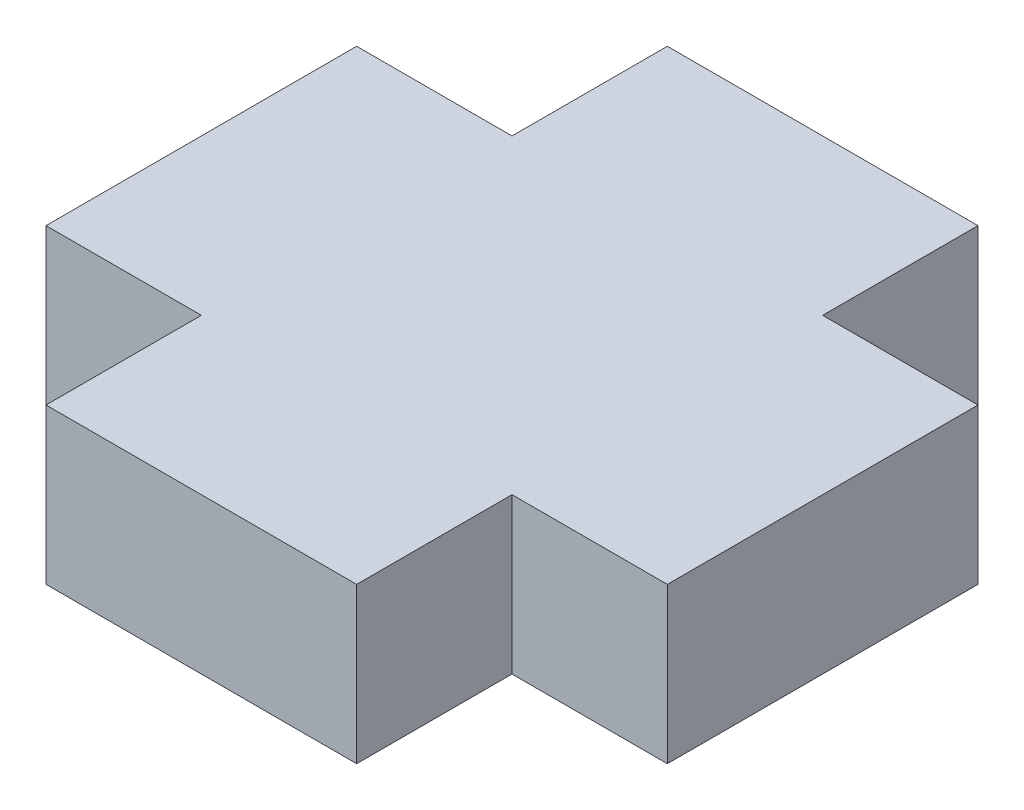
ISO-10303-21;
HEADER;
FILE_DESCRIPTION(('STEP AP214'),'2;1');
FILE_NAME('part.step','',(''),(''),'','','');
FILE_SCHEMA(('AUTOMOTIVE_DESIGN { 1 0 10303 214 1 1 1 1 }'));
ENDSEC;
DATA;
#1=APPLICATION_CONTEXT('core data for automotive mechanical design processes');
#2=APPLICATION_PROTOCOL_DEFINITION('international standard','automotive_design',2000,#1);
#3=PRODUCT_CONTEXT('',#1,'mechanical');
#4=PRODUCT('Part','Part','',(#3));
#5=PRODUCT_RELATED_PRODUCT_CATEGORY('part','',(#4));
#6=PRODUCT_DEFINITION_FORMATION('','',#4);
#7=PRODUCT_DEFINITION_CONTEXT('part definition',#1,'design');
#8=PRODUCT_DEFINITION('design','',#6,#7);
#9=PRODUCT_DEFINITION_SHAPE('','',#8);
#10=(LENGTH_UNIT() NAMED_UNIT(*) SI_UNIT(.MILLI.,.METRE.));
#11=(NAMED_UNIT(*) PLANE_ANGLE_UNIT() SI_UNIT($,.RADIAN.));
#12=(NAMED_UNIT(*) SI_UNIT($,.STERADIAN.) SOLID_ANGLE_UNIT());
#13=UNCERTAINTY_MEASURE_WITH_UNIT(LENGTH_MEASURE(1.E-05),#10,'distance_accuracy_value','');
#14=(GEOMETRIC_REPRESENTATION_CONTEXT(3) GLOBAL_UNCERTAINTY_ASSIGNED_CONTEXT((#13)) GLOBAL_UNIT_ASSIGNED_CONTEXT((#10,
#11,#12)) REPRESENTATION_CONTEXT('',''));
#15=CARTESIAN_POINT('',(0.,0.,0.));
#16=DIRECTION('',(0.,0.,1.));
#17=DIRECTION('',(1.,0.,0.));
#18=AXIS2_PLACEMENT_3D('',#15,#16,#17);
#19=CARTESIAN_POINT('',(0.,5.,0.));
#20=DIRECTION('',(1.,0.,0.));
#21=DIRECTION('',(0.,0.,-1.));
#22=AXIS2_PLACEMENT_3D('',#19,#20,#21);
#23=PLANE('',#22);
#24=DIRECTION('',(0.,0.,1.));
#25=VECTOR('',#24,1.);
#26=CARTESIAN_POINT('',(0.,0.,0.));
#27=LINE('',#26,#25);
#28=CARTESIAN_POINT('',(0.,0.,-10.));
#29=VERTEX_POINT('',#28);
#30=CARTESIAN_POINT('',(0.,0.,0.));
#31=VERTEX_POINT('',#30);
#32=EDGE_CURVE('E155',#29,#31,#27,.T.);
#33=ORIENTED_EDGE('',*,*,#32,.T.);
#34=DIRECTION('',(0.,-1.,0.));
#35=VECTOR('',#34,1.);
#36=CARTESIAN_POINT('',(0.,5.,0.));
#37=LINE('',#36,#35);
#38=CARTESIAN_POINT('',(0.,5.,0.));
#39=VERTEX_POINT('',#38);
#40=EDGE_CURVE('E11',#39,#31,#37,.T.);
#41=ORIENTED_EDGE('',*,*,#40,.F.);
#42=DIRECTION('',(0.,0.,1.));
#43=VECTOR('',#42,1.);
#44=CARTESIAN_POINT('',(0.,5.,0.));
#45=LINE('',#44,#43);
#46=CARTESIAN_POINT('',(0.,5.,-10.));
#47=VERTEX_POINT('',#46);
#48=EDGE_CURVE('E177',#47,#39,#45,.T.);
#49=ORIENTED_EDGE('',*,*,#48,.F.);
#50=DIRECTION('',(0.,-1.,0.));
#51=VECTOR('',#50,1.);
#52=CARTESIAN_POINT('',(0.,5.,-10.));
#53=LINE('',#52,#51);
#54=EDGE_CURVE('E151',#47,#29,#53,.T.);
#55=ORIENTED_EDGE('',*,*,#54,.T.);
#56=EDGE_LOOP('',(#33,#41,#49,#55));
#57=FACE_BOUND('',#56,.T.);
#58=ADVANCED_FACE('F35',(#57),#23,.F.);
#59=CARTESIAN_POINT('',(0.,5.,0.));
#60=DIRECTION('',(0.,0.,-1.));
#61=DIRECTION('',(-1.,0.,0.));
#62=AXIS2_PLACEMENT_3D('',#59,#60,#61);
#63=PLANE('',#62);
#64=DIRECTION('',(1.,0.,0.));
#65=VECTOR('',#64,1.);
#66=CARTESIAN_POINT('',(0.,0.,0.));
#67=LINE('',#66,#65);
#68=CARTESIAN_POINT('',(5.,0.,0.));
#69=VERTEX_POINT('',#68);
#70=EDGE_CURVE('E158',#31,#69,#67,.T.);
#71=ORIENTED_EDGE('',*,*,#70,.T.);
#72=DIRECTION('',(0.,-1.,0.));
#73=VECTOR('',#72,1.);
#74=CARTESIAN_POINT('',(5.,5.,0.));
#75=LINE('',#74,#73);
#76=CARTESIAN_POINT('',(5.,5.,0.));
#77=VERTEX_POINT('',#76);
#78=EDGE_CURVE('E43',#77,#69,#75,.T.);
#79=ORIENTED_EDGE('',*,*,#78,.F.);
#80=DIRECTION('',(1.,0.,0.));
#81=VECTOR('',#80,1.);
#82=CARTESIAN_POINT('',(0.,5.,0.));
#83=LINE('',#82,#81);
#84=EDGE_CURVE('E106',#39,#77,#83,.T.);
#85=ORIENTED_EDGE('',*,*,#84,.F.);
#86=ORIENTED_EDGE('',*,*,#40,.T.);
#87=EDGE_LOOP('',(#71,#79,#85,#86));
#88=FACE_BOUND('',#87,.T.);
#89=ADVANCED_FACE('F255',(#88),#63,.F.);
#90=CARTESIAN_POINT('',(5.,5.,0.));
#91=DIRECTION('',(1.,0.,0.));
#92=DIRECTION('',(0.,0.,-1.));
#93=AXIS2_PLACEMENT_3D('',#90,#91,#92);
#94=PLANE('',#93);
#95=DIRECTION('',(0.,0.,1.));
#96=VECTOR('',#95,1.);
#97=CARTESIAN_POINT('',(5.,0.,0.));
#98=LINE('',#97,#96);
#99=CARTESIAN_POINT('',(5.,0.,5.));
#100=VERTEX_POINT('',#99);
#101=EDGE_CURVE('E160',#69,#100,#98,.T.);
#102=ORIENTED_EDGE('',*,*,#101,.T.);
#103=DIRECTION('',(0.,-1.,0.));
#104=VECTOR('',#103,1.);
#105=CARTESIAN_POINT('',(5.,5.,5.));
#106=LINE('',#105,#104);
#107=CARTESIAN_POINT('',(5.,5.,5.));
#108=VERTEX_POINT('',#107);
#109=EDGE_CURVE('E196',#108,#100,#106,.T.);
#110=ORIENTED_EDGE('',*,*,#109,.F.);
#111=DIRECTION('',(0.,0.,1.));
#112=VECTOR('',#111,1.);
#113=CARTESIAN_POINT('',(5.,5.,0.));
#114=LINE('',#113,#112);
#115=EDGE_CURVE('E204',#77,#108,#114,.T.);
#116=ORIENTED_EDGE('',*,*,#115,.F.);
#117=ORIENTED_EDGE('',*,*,#78,.T.);
#118=EDGE_LOOP('',(#102,#110,#116,#117));
#119=FACE_BOUND('',#118,.T.);
#120=ADVANCED_FACE('F202',(#119),#94,.F.);
#121=CARTESIAN_POINT('',(5.,5.,5.));
#122=DIRECTION('',(0.,0.,-1.));
#123=DIRECTION('',(-1.,0.,0.));
#124=AXIS2_PLACEMENT_3D('',#121,#122,#123);
#125=PLANE('',#124);
#126=DIRECTION('',(1.,0.,0.));
#127=VECTOR('',#126,1.);
#128=CARTESIAN_POINT('',(5.,0.,5.));
#129=LINE('',#128,#127);
#130=CARTESIAN_POINT('',(15.,0.,5.));
#131=VERTEX_POINT('',#130);
#132=EDGE_CURVE('E162',#100,#131,#129,.T.);
#133=ORIENTED_EDGE('',*,*,#132,.T.);
#134=DIRECTION('',(0.,-1.,0.));
#135=VECTOR('',#134,1.);
#136=CARTESIAN_POINT('',(15.,5.,5.));
#137=LINE('',#136,#135);
#138=CARTESIAN_POINT('',(15.,5.,5.));
#139=VERTEX_POINT('',#138);
#140=EDGE_CURVE('E193',#139,#131,#137,.T.);
#141=ORIENTED_EDGE('',*,*,#140,.F.);
#142=DIRECTION('',(1.,0.,0.));
#143=VECTOR('',#142,1.);
#144=CARTESIAN_POINT('',(5.,5.,5.));
#145=LINE('',#144,#143);
#146=EDGE_CURVE('E222',#108,#139,#145,.T.);
#147=ORIENTED_EDGE('',*,*,#146,.F.);
#148=ORIENTED_EDGE('',*,*,#109,.T.);
#149=EDGE_LOOP('',(#133,#141,#147,#148));
#150=FACE_BOUND('',#149,.T.);
#151=ADVANCED_FACE('F213',(#150),#125,.F.);
#152=CARTESIAN_POINT('',(15.,5.,0.));
#153=DIRECTION('',(-1.,0.,0.));
#154=DIRECTION('',(0.,0.,1.));
#155=AXIS2_PLACEMENT_3D('',#152,#153,#154);
#156=PLANE('',#155);
#157=DIRECTION('',(0.,0.,-1.));
#158=VECTOR('',#157,1.);
#159=CARTESIAN_POINT('',(15.,0.,0.));
#160=LINE('',#159,#158);
#161=CARTESIAN_POINT('',(15.,0.,0.));
#162=VERTEX_POINT('',#161);
#163=EDGE_CURVE('E164',#131,#162,#160,.T.);
#164=ORIENTED_EDGE('',*,*,#163,.T.);
#165=DIRECTION('',(0.,-1.,0.));
#166=VECTOR('',#165,1.);
#167=CARTESIAN_POINT('',(15.,5.,0.));
#168=LINE('',#167,#166);
#169=CARTESIAN_POINT('',(15.,5.,0.));
#170=VERTEX_POINT('',#169);
#171=EDGE_CURVE('E190',#170,#162,#168,.T.);
#172=ORIENTED_EDGE('',*,*,#171,.F.);
#173=DIRECTION('',(0.,0.,-1.));
#174=VECTOR('',#173,1.);
#175=CARTESIAN_POINT('',(15.,5.,0.));
#176=LINE('',#175,#174);
#177=EDGE_CURVE('E219',#139,#170,#176,.T.);
#178=ORIENTED_EDGE('',*,*,#177,.F.);
#179=ORIENTED_EDGE('',*,*,#140,.T.);
#180=EDGE_LOOP('',(#164,#172,#178,#179));
#181=FACE_BOUND('',#180,.T.);
#182=ADVANCED_FACE('F217',(#181),#156,.F.);
#183=CARTESIAN_POINT('',(15.,5.,0.));
#184=DIRECTION('',(0.,0.,-1.));
#185=DIRECTION('',(-1.,0.,0.));
#186=AXIS2_PLACEMENT_3D('',#183,#184,#185);
#187=PLANE('',#186);
#188=DIRECTION('',(1.,0.,0.));
#189=VECTOR('',#188,1.);
#190=CARTESIAN_POINT('',(15.,0.,0.));
#191=LINE('',#190,#189);
#192=CARTESIAN_POINT('',(20.,0.,0.));
#193=VERTEX_POINT('',#192);
#194=EDGE_CURVE('E166',#162,#193,#191,.T.);
#195=ORIENTED_EDGE('',*,*,#194,.T.);
#196=DIRECTION('',(0.,-1.,0.));
#197=VECTOR('',#196,1.);
#198=CARTESIAN_POINT('',(20.,5.,0.));
#199=LINE('',#198,#197);
#200=CARTESIAN_POINT('',(20.,5.,0.));
#201=VERTEX_POINT('',#200);
#202=EDGE_CURVE('E187',#201,#193,#199,.T.);
#203=ORIENTED_EDGE('',*,*,#202,.F.);
#204=DIRECTION('',(1.,0.,0.));
#205=VECTOR('',#204,1.);
#206=CARTESIAN_POINT('',(15.,5.,0.));
#207=LINE('',#206,#205);
#208=EDGE_CURVE('E221',#170,#201,#207,.T.);
#209=ORIENTED_EDGE('',*,*,#208,.F.);
#210=ORIENTED_EDGE('',*,*,#171,.T.);
#211=EDGE_LOOP('',(#195,#203,#209,#210));
#212=FACE_BOUND('',#211,.T.);
#213=ADVANCED_FACE('F268',(#212),#187,.F.);
#214=CARTESIAN_POINT('',(20.,5.,0.));
#215=DIRECTION('',(-1.,0.,0.));
#216=DIRECTION('',(0.,0.,1.));
#217=AXIS2_PLACEMENT_3D('',#214,#215,#216);
#218=PLANE('',#217);
#219=DIRECTION('',(0.,0.,-1.));
#220=VECTOR('',#219,1.);
#221=CARTESIAN_POINT('',(20.,0.,0.));
#222=LINE('',#221,#220);
#223=CARTESIAN_POINT('',(20.,0.,-10.));
#224=VERTEX_POINT('',#223);
#225=EDGE_CURVE('E168',#193,#224,#222,.T.);
#226=ORIENTED_EDGE('',*,*,#225,.T.);
#227=DIRECTION('',(0.,-1.,0.));
#228=VECTOR('',#227,1.);
#229=CARTESIAN_POINT('',(20.,5.,-10.));
#230=LINE('',#229,#228);
#231=CARTESIAN_POINT('',(20.,5.,-10.));
#232=VERTEX_POINT('',#231);
#233=EDGE_CURVE('E184',#232,#224,#230,.T.);
#234=ORIENTED_EDGE('',*,*,#233,.F.);
#235=DIRECTION('',(0.,0.,-1.));
#236=VECTOR('',#235,1.);
#237=CARTESIAN_POINT('',(20.,5.,0.));
#238=LINE('',#237,#236);
#239=EDGE_CURVE('E224',#201,#232,#238,.T.);
#240=ORIENTED_EDGE('',*,*,#239,.F.);
#241=ORIENTED_EDGE('',*,*,#202,.T.);
#242=EDGE_LOOP('',(#226,#234,#240,#241));
#243=FACE_BOUND('',#242,.T.);
#244=ADVANCED_FACE('F271',(#243),#218,.F.);
#245=CARTESIAN_POINT('',(15.,5.,-10.));
#246=DIRECTION('',(0.,0.,1.));
#247=DIRECTION('',(1.,0.,0.));
#248=AXIS2_PLACEMENT_3D('',#245,#246,#247);
#249=PLANE('',#248);
#250=DIRECTION('',(-1.,0.,0.));
#251=VECTOR('',#250,1.);
#252=CARTESIAN_POINT('',(15.,0.,-10.));
#253=LINE('',#252,#251);
#254=CARTESIAN_POINT('',(15.,0.,-10.));
#255=VERTEX_POINT('',#254);
#256=EDGE_CURVE('E170',#224,#255,#253,.T.);
#257=ORIENTED_EDGE('',*,*,#256,.T.);
#258=DIRECTION('',(0.,-1.,0.));
#259=VECTOR('',#258,1.);
#260=CARTESIAN_POINT('',(15.,5.,-10.));
#261=LINE('',#260,#259);
#262=CARTESIAN_POINT('',(15.,5.,-10.));
#263=VERTEX_POINT('',#262);
#264=EDGE_CURVE('E181',#263,#255,#261,.T.);
#265=ORIENTED_EDGE('',*,*,#264,.F.);
#266=DIRECTION('',(-1.,0.,0.));
#267=VECTOR('',#266,1.);
#268=CARTESIAN_POINT('',(15.,5.,-10.));
#269=LINE('',#268,#267);
#270=EDGE_CURVE('E230',#232,#263,#269,.T.);
#271=ORIENTED_EDGE('',*,*,#270,.F.);
#272=ORIENTED_EDGE('',*,*,#233,.T.);
#273=EDGE_LOOP('',(#257,#265,#271,#272));
#274=FACE_BOUND('',#273,.T.);
#275=ADVANCED_FACE('F236',(#274),#249,.F.);
#276=CARTESIAN_POINT('',(15.,5.,-10.));
#277=DIRECTION('',(-1.,0.,0.));
#278=DIRECTION('',(0.,0.,1.));
#279=AXIS2_PLACEMENT_3D('',#276,#277,#278);
#280=PLANE('',#279);
#281=DIRECTION('',(0.,0.,-1.));
#282=VECTOR('',#281,1.);
#283=CARTESIAN_POINT('',(15.,0.,-10.));
#284=LINE('',#283,#282);
#285=CARTESIAN_POINT('',(15.,0.,-15.));
#286=VERTEX_POINT('',#285);
#287=EDGE_CURVE('E172',#255,#286,#284,.T.);
#288=ORIENTED_EDGE('',*,*,#287,.T.);
#289=DIRECTION('',(0.,-1.,0.));
#290=VECTOR('',#289,1.);
#291=CARTESIAN_POINT('',(15.,5.,-15.));
#292=LINE('',#291,#290);
#293=CARTESIAN_POINT('',(15.,5.,-15.));
#294=VERTEX_POINT('',#293);
#295=EDGE_CURVE('E146',#294,#286,#292,.T.);
#296=ORIENTED_EDGE('',*,*,#295,.F.);
#297=DIRECTION('',(0.,0.,-1.));
#298=VECTOR('',#297,1.);
#299=CARTESIAN_POINT('',(15.,5.,-10.));
#300=LINE('',#299,#298);
#301=EDGE_CURVE('E137',#263,#294,#300,.T.);
#302=ORIENTED_EDGE('',*,*,#301,.F.);
#303=ORIENTED_EDGE('',*,*,#264,.T.);
#304=EDGE_LOOP('',(#288,#296,#302,#303));
#305=FACE_BOUND('',#304,.T.);
#306=ADVANCED_FACE('F240',(#305),#280,.F.);
#307=CARTESIAN_POINT('',(5.,5.,-15.));
#308=DIRECTION('',(0.,0.,1.));
#309=DIRECTION('',(1.,0.,0.));
#310=AXIS2_PLACEMENT_3D('',#307,#308,#309);
#311=PLANE('',#310);
#312=DIRECTION('',(-1.,0.,0.));
#313=VECTOR('',#312,1.);
#314=CARTESIAN_POINT('',(5.,0.,-15.));
#315=LINE('',#314,#313);
#316=CARTESIAN_POINT('',(5.,0.,-15.));
#317=VERTEX_POINT('',#316);
#318=EDGE_CURVE('E145',#286,#317,#315,.T.);
#319=ORIENTED_EDGE('',*,*,#318,.T.);
#320=DIRECTION('',(0.,-1.,0.));
#321=VECTOR('',#320,1.);
#322=CARTESIAN_POINT('',(5.,5.,-15.));
#323=LINE('',#322,#321);
#324=CARTESIAN_POINT('',(5.,5.,-15.));
#325=VERTEX_POINT('',#324);
#326=EDGE_CURVE('E142',#325,#317,#323,.T.);
#327=ORIENTED_EDGE('',*,*,#326,.F.);
#328=DIRECTION('',(-1.,0.,0.));
#329=VECTOR('',#328,1.);
#330=CARTESIAN_POINT('',(5.,5.,-15.));
#331=LINE('',#330,#329);
#332=EDGE_CURVE('E131',#294,#325,#331,.T.);
#333=ORIENTED_EDGE('',*,*,#332,.F.);
#334=ORIENTED_EDGE('',*,*,#295,.T.);
#335=EDGE_LOOP('',(#319,#327,#333,#334));
#336=FACE_BOUND('',#335,.T.);
#337=ADVANCED_FACE('F143',(#336),#311,.F.);
#338=CARTESIAN_POINT('',(5.,5.,-10.));
#339=DIRECTION('',(1.,0.,0.));
#340=DIRECTION('',(0.,0.,-1.));
#341=AXIS2_PLACEMENT_3D('',#338,#339,#340);
#342=PLANE('',#341);
#343=DIRECTION('',(0.,0.,1.));
#344=VECTOR('',#343,1.);
#345=CARTESIAN_POINT('',(5.,0.,-10.));
#346=LINE('',#345,#344);
#347=CARTESIAN_POINT('',(5.,0.,-10.));
#348=VERTEX_POINT('',#347);
#349=EDGE_CURVE('E92',#317,#348,#346,.T.);
#350=ORIENTED_EDGE('',*,*,#349,.T.);
#351=DIRECTION('',(0.,-1.,0.));
#352=VECTOR('',#351,1.);
#353=CARTESIAN_POINT('',(5.,5.,-10.));
#354=LINE('',#353,#352);
#355=CARTESIAN_POINT('',(5.,5.,-10.));
#356=VERTEX_POINT('',#355);
#357=EDGE_CURVE('E147',#356,#348,#354,.T.);
#358=ORIENTED_EDGE('',*,*,#357,.F.);
#359=DIRECTION('',(0.,0.,1.));
#360=VECTOR('',#359,1.);
#361=CARTESIAN_POINT('',(5.,5.,-10.));
#362=LINE('',#361,#360);
#363=EDGE_CURVE('E135',#325,#356,#362,.T.);
#364=ORIENTED_EDGE('',*,*,#363,.F.);
#365=ORIENTED_EDGE('',*,*,#326,.T.);
#366=EDGE_LOOP('',(#350,#358,#364,#365));
#367=FACE_BOUND('',#366,.T.);
#368=ADVANCED_FACE('F149',(#367),#342,.F.);
#369=CARTESIAN_POINT('',(0.,5.,-10.));
#370=DIRECTION('',(0.,0.,1.));
#371=DIRECTION('',(1.,0.,0.));
#372=AXIS2_PLACEMENT_3D('',#369,#370,#371);
#373=PLANE('',#372);
#374=DIRECTION('',(-1.,0.,0.));
#375=VECTOR('',#374,1.);
#376=CARTESIAN_POINT('',(0.,0.,-10.));
#377=LINE('',#376,#375);
#378=EDGE_CURVE('E98',#348,#29,#377,.T.);
#379=ORIENTED_EDGE('',*,*,#378,.T.);
#380=ORIENTED_EDGE('',*,*,#54,.F.);
#381=DIRECTION('',(-1.,0.,0.));
#382=VECTOR('',#381,1.);
#383=CARTESIAN_POINT('',(0.,5.,-10.));
#384=LINE('',#383,#382);
#385=EDGE_CURVE('E51',#356,#47,#384,.T.);
#386=ORIENTED_EDGE('',*,*,#385,.F.);
#387=ORIENTED_EDGE('',*,*,#357,.T.);
#388=EDGE_LOOP('',(#379,#380,#386,#387));
#389=FACE_BOUND('',#388,.T.);
#390=ADVANCED_FACE('F244',(#389),#373,.F.);
#391=CARTESIAN_POINT('',(0.,5.,0.));
#392=DIRECTION('',(0.,-1.,0.));
#393=DIRECTION('',(0.,0.,-1.));
#394=AXIS2_PLACEMENT_3D('',#391,#392,#393);
#395=PLANE('',#394);
#396=ORIENTED_EDGE('',*,*,#48,.T.);
#397=ORIENTED_EDGE('',*,*,#84,.T.);
#398=ORIENTED_EDGE('',*,*,#115,.T.);
#399=ORIENTED_EDGE('',*,*,#146,.T.);
#400=ORIENTED_EDGE('',*,*,#177,.T.);
#401=ORIENTED_EDGE('',*,*,#208,.T.);
#402=ORIENTED_EDGE('',*,*,#239,.T.);
#403=ORIENTED_EDGE('',*,*,#270,.T.);
#404=ORIENTED_EDGE('',*,*,#301,.T.);
#405=ORIENTED_EDGE('',*,*,#332,.T.);
#406=ORIENTED_EDGE('',*,*,#363,.T.);
#407=ORIENTED_EDGE('',*,*,#385,.T.);
#408=EDGE_LOOP('',(#396,#397,#398,#399,#400,#401,#402,#403,#404,#405,#406,#407));
#409=FACE_BOUND('',#408,.T.);
#410=ADVANCED_FACE('F133',(#409),#395,.F.);
#411=CARTESIAN_POINT('',(0.,0.,0.));
#412=DIRECTION('',(0.,-1.,0.));
#413=DIRECTION('',(0.,0.,-1.));
#414=AXIS2_PLACEMENT_3D('',#411,#412,#413);
#415=PLANE('',#414);
#416=ORIENTED_EDGE('',*,*,#32,.F.);
#417=ORIENTED_EDGE('',*,*,#378,.F.);
#418=ORIENTED_EDGE('',*,*,#349,.F.);
#419=ORIENTED_EDGE('',*,*,#318,.F.);
#420=ORIENTED_EDGE('',*,*,#287,.F.);
#421=ORIENTED_EDGE('',*,*,#256,.F.);
#422=ORIENTED_EDGE('',*,*,#225,.F.);
#423=ORIENTED_EDGE('',*,*,#194,.F.);
#424=ORIENTED_EDGE('',*,*,#163,.F.);
#425=ORIENTED_EDGE('',*,*,#132,.F.);
#426=ORIENTED_EDGE('',*,*,#101,.F.);
#427=ORIENTED_EDGE('',*,*,#70,.F.);
#428=EDGE_LOOP('',(#416,#417,#418,#419,#420,#421,#422,#423,#424,#425,#426,#427));
#429=FACE_BOUND('',#428,.T.);
#430=ADVANCED_FACE('F208',(#429),#415,.T.);
#431=CLOSED_SHELL('',(#58,#89,#120,#151,#182,#213,#244,#275,#306,#337,#368,#390,#410,#430));
#432=MANIFOLD_SOLID_BREP('B2',#431);
#433=ADVANCED_BREP_SHAPE_REPRESENTATION('',(#18,#432),#14);
#434=SHAPE_DEFINITION_REPRESENTATION(#9,#433);
ENDSEC;
END-ISO-10303-21;
